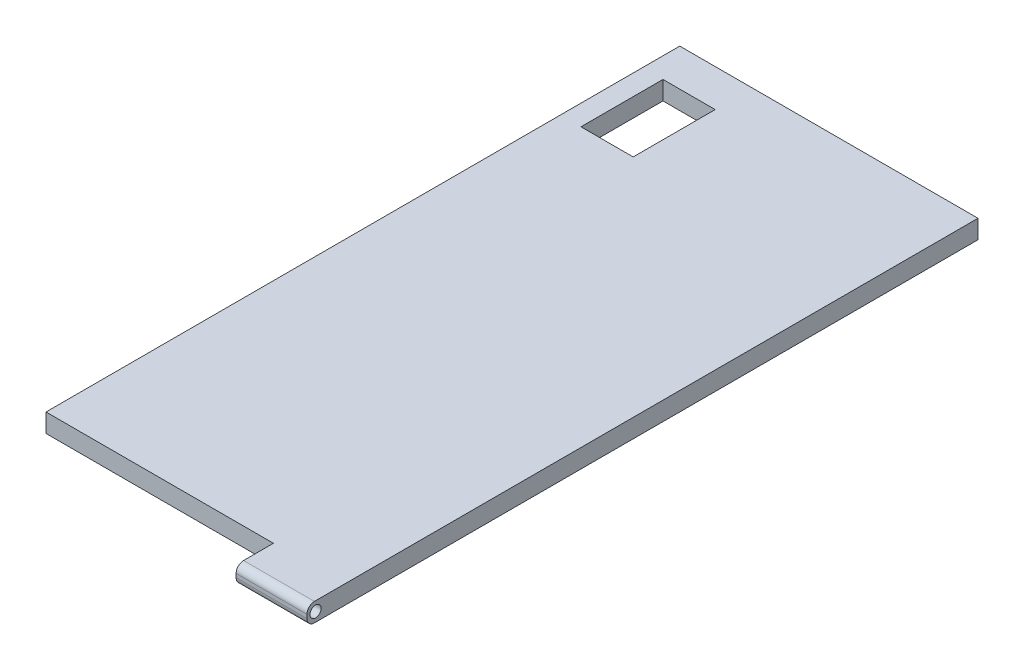
ISO-10303-21;
HEADER;
FILE_DESCRIPTION(('STEP AP214'),'2;1');
FILE_NAME('part.step','',(''),(''),'','','');
FILE_SCHEMA(('AUTOMOTIVE_DESIGN { 1 0 10303 214 1 1 1 1 }'));
ENDSEC;
DATA;
#1=APPLICATION_CONTEXT('core data for automotive mechanical design processes');
#2=APPLICATION_PROTOCOL_DEFINITION('international standard','automotive_design',2000,#1);
#3=PRODUCT_CONTEXT('',#1,'mechanical');
#4=PRODUCT('Part','Part','',(#3));
#5=PRODUCT_RELATED_PRODUCT_CATEGORY('part','',(#4));
#6=PRODUCT_DEFINITION_FORMATION('','',#4);
#7=PRODUCT_DEFINITION_CONTEXT('part definition',#1,'design');
#8=PRODUCT_DEFINITION('design','',#6,#7);
#9=PRODUCT_DEFINITION_SHAPE('','',#8);
#10=(LENGTH_UNIT() NAMED_UNIT(*) SI_UNIT(.MILLI.,.METRE.));
#11=(NAMED_UNIT(*) PLANE_ANGLE_UNIT() SI_UNIT($,.RADIAN.));
#12=(NAMED_UNIT(*) SI_UNIT($,.STERADIAN.) SOLID_ANGLE_UNIT());
#13=UNCERTAINTY_MEASURE_WITH_UNIT(LENGTH_MEASURE(1.E-05),#10,'distance_accuracy_value','');
#14=(GEOMETRIC_REPRESENTATION_CONTEXT(3) GLOBAL_UNCERTAINTY_ASSIGNED_CONTEXT((#13)) GLOBAL_UNIT_ASSIGNED_CONTEXT((#10,
#11,#12)) REPRESENTATION_CONTEXT('',''));
#15=CARTESIAN_POINT('',(0.,0.,0.));
#16=DIRECTION('',(0.,0.,1.));
#17=DIRECTION('',(1.,0.,0.));
#18=AXIS2_PLACEMENT_3D('',#15,#16,#17);
#19=CARTESIAN_POINT('',(20.,2.5,42.5));
#20=DIRECTION('',(-1.,0.,0.));
#21=DIRECTION('',(0.,0.,1.));
#22=AXIS2_PLACEMENT_3D('',#19,#20,#21);
#23=PLANE('',#22);
#24=CARTESIAN_POINT('',(20.,1.25,46.35));
#25=DIRECTION('',(-1.,0.,0.));
#26=DIRECTION('',(0.,0.,1.));
#27=AXIS2_PLACEMENT_3D('',#24,#25,#26);
#28=CIRCLE('',#27,0.749999999999999);
#29=CARTESIAN_POINT('',(20.,1.25,47.1));
#30=VERTEX_POINT('',#29);
#31=EDGE_CURVE('E341',#30,#30,#28,.T.);
#32=ORIENTED_EDGE('',*,*,#31,.T.);
#33=EDGE_LOOP('',(#32));
#34=FACE_BOUND('',#33,.T.);
#35=DIRECTION('',(0.,1.,0.));
#36=VECTOR('',#35,1.);
#37=CARTESIAN_POINT('',(20.,0.,47.5));
#38=LINE('',#37,#36);
#39=CARTESIAN_POINT('',(20.,1.,47.5));
#40=VERTEX_POINT('',#39);
#41=CARTESIAN_POINT('',(20.,1.5,47.5));
#42=VERTEX_POINT('',#41);
#43=EDGE_CURVE('E184',#40,#42,#38,.T.);
#44=ORIENTED_EDGE('',*,*,#43,.F.);
#45=CARTESIAN_POINT('',(20.,1.,46.5));
#46=DIRECTION('',(-1.,0.,0.));
#47=DIRECTION('',(0.,0.,1.));
#48=AXIS2_PLACEMENT_3D('',#45,#46,#47);
#49=CIRCLE('',#48,1.);
#50=CARTESIAN_POINT('',(20.,0.,46.5));
#51=VERTEX_POINT('',#50);
#52=EDGE_CURVE('E68',#40,#51,#49,.F.);
#53=ORIENTED_EDGE('',*,*,#52,.T.);
#54=DIRECTION('',(0.,0.,-1.));
#55=VECTOR('',#54,1.);
#56=CARTESIAN_POINT('',(20.,0.,42.5));
#57=LINE('',#56,#55);
#58=CARTESIAN_POINT('',(20.,0.,-42.5));
#59=VERTEX_POINT('',#58);
#60=EDGE_CURVE('E187',#51,#59,#57,.T.);
#61=ORIENTED_EDGE('',*,*,#60,.T.);
#62=DIRECTION('',(0.,-1.,0.));
#63=VECTOR('',#62,1.);
#64=CARTESIAN_POINT('',(20.,2.5,-42.5));
#65=LINE('',#64,#63);
#66=CARTESIAN_POINT('',(20.,2.5,-42.5));
#67=VERTEX_POINT('',#66);
#68=EDGE_CURVE('E227',#67,#59,#65,.T.);
#69=ORIENTED_EDGE('',*,*,#68,.F.);
#70=DIRECTION('',(0.,0.,-1.));
#71=VECTOR('',#70,1.);
#72=CARTESIAN_POINT('',(20.,2.5,42.5));
#73=LINE('',#72,#71);
#74=CARTESIAN_POINT('',(20.,2.5,46.5));
#75=VERTEX_POINT('',#74);
#76=EDGE_CURVE('E194',#75,#67,#73,.T.);
#77=ORIENTED_EDGE('',*,*,#76,.F.);
#78=CARTESIAN_POINT('',(20.,1.5,46.5));
#79=DIRECTION('',(-1.,0.,0.));
#80=DIRECTION('',(0.,0.,1.));
#81=AXIS2_PLACEMENT_3D('',#78,#79,#80);
#82=CIRCLE('',#81,1.);
#83=EDGE_CURVE('E246',#75,#42,#82,.F.);
#84=ORIENTED_EDGE('',*,*,#83,.T.);
#85=EDGE_LOOP('',(#44,#53,#61,#69,#77,#84));
#86=FACE_BOUND('',#85,.T.);
#87=ADVANCED_FACE('F45',(#34,#86),#23,.F.);
#88=CARTESIAN_POINT('',(-20.,2.5,-42.5));
#89=DIRECTION('',(0.,0.,1.));
#90=DIRECTION('',(1.,0.,0.));
#91=AXIS2_PLACEMENT_3D('',#88,#89,#90);
#92=PLANE('',#91);
#93=DIRECTION('',(-1.,0.,0.));
#94=VECTOR('',#93,1.);
#95=CARTESIAN_POINT('',(-20.,0.,-42.5));
#96=LINE('',#95,#94);
#97=CARTESIAN_POINT('',(-20.,0.,-42.5));
#98=VERTEX_POINT('',#97);
#99=EDGE_CURVE('E211',#59,#98,#96,.T.);
#100=ORIENTED_EDGE('',*,*,#99,.T.);
#101=DIRECTION('',(0.,-1.,0.));
#102=VECTOR('',#101,1.);
#103=CARTESIAN_POINT('',(-20.,2.5,-42.5));
#104=LINE('',#103,#102);
#105=CARTESIAN_POINT('',(-20.,2.5,-42.5));
#106=VERTEX_POINT('',#105);
#107=EDGE_CURVE('E223',#106,#98,#104,.T.);
#108=ORIENTED_EDGE('',*,*,#107,.F.);
#109=DIRECTION('',(-1.,0.,0.));
#110=VECTOR('',#109,1.);
#111=CARTESIAN_POINT('',(-20.,2.5,-42.5));
#112=LINE('',#111,#110);
#113=EDGE_CURVE('E197',#67,#106,#112,.T.);
#114=ORIENTED_EDGE('',*,*,#113,.F.);
#115=ORIENTED_EDGE('',*,*,#68,.T.);
#116=EDGE_LOOP('',(#100,#108,#114,#115));
#117=FACE_BOUND('',#116,.T.);
#118=ADVANCED_FACE('F292',(#117),#92,.F.);
#119=CARTESIAN_POINT('',(-20.,2.5,42.5));
#120=DIRECTION('',(1.,0.,0.));
#121=DIRECTION('',(0.,0.,-1.));
#122=AXIS2_PLACEMENT_3D('',#119,#120,#121);
#123=PLANE('',#122);
#124=DIRECTION('',(0.,0.,1.));
#125=VECTOR('',#124,1.);
#126=CARTESIAN_POINT('',(-20.,0.,42.5));
#127=LINE('',#126,#125);
#128=CARTESIAN_POINT('',(-20.,0.,42.5));
#129=VERTEX_POINT('',#128);
#130=EDGE_CURVE('E214',#98,#129,#127,.T.);
#131=ORIENTED_EDGE('',*,*,#130,.T.);
#132=DIRECTION('',(0.,-1.,0.));
#133=VECTOR('',#132,1.);
#134=CARTESIAN_POINT('',(-20.,2.5,42.5));
#135=LINE('',#134,#133);
#136=CARTESIAN_POINT('',(-20.,2.5,42.5));
#137=VERTEX_POINT('',#136);
#138=EDGE_CURVE('E208',#137,#129,#135,.T.);
#139=ORIENTED_EDGE('',*,*,#138,.F.);
#140=DIRECTION('',(0.,0.,1.));
#141=VECTOR('',#140,1.);
#142=CARTESIAN_POINT('',(-20.,2.5,42.5));
#143=LINE('',#142,#141);
#144=EDGE_CURVE('E201',#106,#137,#143,.T.);
#145=ORIENTED_EDGE('',*,*,#144,.F.);
#146=ORIENTED_EDGE('',*,*,#107,.T.);
#147=EDGE_LOOP('',(#131,#139,#145,#146));
#148=FACE_BOUND('',#147,.T.);
#149=ADVANCED_FACE('F288',(#148),#123,.F.);
#150=CARTESIAN_POINT('',(-20.,2.5,42.5));
#151=DIRECTION('',(0.,0.,-1.));
#152=DIRECTION('',(-1.,0.,0.));
#153=AXIS2_PLACEMENT_3D('',#150,#151,#152);
#154=PLANE('',#153);
#155=DIRECTION('',(1.,0.,0.));
#156=VECTOR('',#155,1.);
#157=CARTESIAN_POINT('',(-20.,0.,42.5));
#158=LINE('',#157,#156);
#159=CARTESIAN_POINT('',(10.5,0.,42.5));
#160=VERTEX_POINT('',#159);
#161=EDGE_CURVE('E198',#129,#160,#158,.T.);
#162=ORIENTED_EDGE('',*,*,#161,.T.);
#163=DIRECTION('',(0.,1.,0.));
#164=VECTOR('',#163,1.);
#165=CARTESIAN_POINT('',(10.5,0.,42.5));
#166=LINE('',#165,#164);
#167=CARTESIAN_POINT('',(10.5,2.5,42.5));
#168=VERTEX_POINT('',#167);
#169=EDGE_CURVE('E180',#160,#168,#166,.T.);
#170=ORIENTED_EDGE('',*,*,#169,.T.);
#171=DIRECTION('',(1.,0.,0.));
#172=VECTOR('',#171,1.);
#173=CARTESIAN_POINT('',(-20.,2.5,42.5));
#174=LINE('',#173,#172);
#175=EDGE_CURVE('E204',#137,#168,#174,.T.);
#176=ORIENTED_EDGE('',*,*,#175,.F.);
#177=ORIENTED_EDGE('',*,*,#138,.T.);
#178=EDGE_LOOP('',(#162,#170,#176,#177));
#179=FACE_BOUND('',#178,.T.);
#180=ADVANCED_FACE('F282',(#179),#154,.F.);
#181=CARTESIAN_POINT('',(0.,2.5,0.));
#182=DIRECTION('',(0.,-1.,0.));
#183=DIRECTION('',(0.,0.,-1.));
#184=AXIS2_PLACEMENT_3D('',#181,#182,#183);
#185=PLANE('',#184);
#186=DIRECTION('',(1.,0.,0.));
#187=VECTOR('',#186,1.);
#188=CARTESIAN_POINT('',(-17.25,2.5,-26.5));
#189=LINE('',#188,#187);
#190=CARTESIAN_POINT('',(-17.25,2.5,-26.5));
#191=VERTEX_POINT('',#190);
#192=CARTESIAN_POINT('',(-10.25,2.5,-26.5));
#193=VERTEX_POINT('',#192);
#194=EDGE_CURVE('E151',#191,#193,#189,.T.);
#195=ORIENTED_EDGE('',*,*,#194,.F.);
#196=DIRECTION('',(0.,0.,1.));
#197=VECTOR('',#196,1.);
#198=CARTESIAN_POINT('',(-17.25,2.5,-37.5));
#199=LINE('',#198,#197);
#200=CARTESIAN_POINT('',(-17.25,2.5,-37.5));
#201=VERTEX_POINT('',#200);
#202=EDGE_CURVE('E157',#201,#191,#199,.T.);
#203=ORIENTED_EDGE('',*,*,#202,.F.);
#204=DIRECTION('',(-1.,0.,0.));
#205=VECTOR('',#204,1.);
#206=CARTESIAN_POINT('',(-17.25,2.5,-37.5));
#207=LINE('',#206,#205);
#208=CARTESIAN_POINT('',(-10.25,2.5,-37.5));
#209=VERTEX_POINT('',#208);
#210=EDGE_CURVE('E162',#209,#201,#207,.T.);
#211=ORIENTED_EDGE('',*,*,#210,.F.);
#212=DIRECTION('',(0.,0.,-1.));
#213=VECTOR('',#212,1.);
#214=CARTESIAN_POINT('',(-10.25,2.5,-37.5));
#215=LINE('',#214,#213);
#216=EDGE_CURVE('E139',#193,#209,#215,.T.);
#217=ORIENTED_EDGE('',*,*,#216,.F.);
#218=EDGE_LOOP('',(#195,#203,#211,#217));
#219=FACE_BOUND('',#218,.T.);
#220=DIRECTION('',(0.,0.,1.));
#221=VECTOR('',#220,1.);
#222=CARTESIAN_POINT('',(10.5,2.5,42.5));
#223=LINE('',#222,#221);
#224=CARTESIAN_POINT('',(10.5,2.5,46.5));
#225=VERTEX_POINT('',#224);
#226=EDGE_CURVE('E172',#168,#225,#223,.T.);
#227=ORIENTED_EDGE('',*,*,#226,.T.);
#228=DIRECTION('',(1.,0.,0.));
#229=VECTOR('',#228,1.);
#230=CARTESIAN_POINT('',(20.,2.5,46.5));
#231=LINE('',#230,#229);
#232=EDGE_CURVE('E242',#225,#75,#231,.T.);
#233=ORIENTED_EDGE('',*,*,#232,.T.);
#234=ORIENTED_EDGE('',*,*,#76,.T.);
#235=ORIENTED_EDGE('',*,*,#113,.T.);
#236=ORIENTED_EDGE('',*,*,#144,.T.);
#237=ORIENTED_EDGE('',*,*,#175,.T.);
#238=EDGE_LOOP('',(#227,#233,#234,#235,#236,#237));
#239=FACE_BOUND('',#238,.T.);
#240=ADVANCED_FACE('F159',(#219,#239),#185,.F.);
#241=CARTESIAN_POINT('',(0.,0.,0.));
#242=DIRECTION('',(0.,-1.,0.));
#243=DIRECTION('',(0.,0.,-1.));
#244=AXIS2_PLACEMENT_3D('',#241,#242,#243);
#245=PLANE('',#244);
#246=DIRECTION('',(0.,0.,-1.));
#247=VECTOR('',#246,1.);
#248=CARTESIAN_POINT('',(-17.25,0.,0.));
#249=LINE('',#248,#247);
#250=CARTESIAN_POINT('',(-17.25,0.,-26.5));
#251=VERTEX_POINT('',#250);
#252=CARTESIAN_POINT('',(-17.25,0.,-37.5));
#253=VERTEX_POINT('',#252);
#254=EDGE_CURVE('E239',#251,#253,#249,.T.);
#255=ORIENTED_EDGE('',*,*,#254,.F.);
#256=DIRECTION('',(-1.,0.,0.));
#257=VECTOR('',#256,1.);
#258=CARTESIAN_POINT('',(0.,0.,-26.5));
#259=LINE('',#258,#257);
#260=CARTESIAN_POINT('',(-10.25,0.,-26.5));
#261=VERTEX_POINT('',#260);
#262=EDGE_CURVE('E231',#261,#251,#259,.T.);
#263=ORIENTED_EDGE('',*,*,#262,.F.);
#264=DIRECTION('',(0.,0.,1.));
#265=VECTOR('',#264,1.);
#266=CARTESIAN_POINT('',(-10.25,0.,0.));
#267=LINE('',#266,#265);
#268=CARTESIAN_POINT('',(-10.25,0.,-37.5));
#269=VERTEX_POINT('',#268);
#270=EDGE_CURVE('E142',#269,#261,#267,.T.);
#271=ORIENTED_EDGE('',*,*,#270,.F.);
#272=DIRECTION('',(1.,0.,0.));
#273=VECTOR('',#272,1.);
#274=CARTESIAN_POINT('',(0.,0.,-37.5));
#275=LINE('',#274,#273);
#276=EDGE_CURVE('E236',#253,#269,#275,.T.);
#277=ORIENTED_EDGE('',*,*,#276,.F.);
#278=EDGE_LOOP('',(#255,#263,#271,#277));
#279=FACE_BOUND('',#278,.T.);
#280=ORIENTED_EDGE('',*,*,#60,.F.);
#281=DIRECTION('',(1.,0.,0.));
#282=VECTOR('',#281,1.);
#283=CARTESIAN_POINT('',(0.,0.,46.5));
#284=LINE('',#283,#282);
#285=CARTESIAN_POINT('',(10.5,0.,46.5));
#286=VERTEX_POINT('',#285);
#287=EDGE_CURVE('E54',#51,#286,#284,.F.);
#288=ORIENTED_EDGE('',*,*,#287,.T.);
#289=DIRECTION('',(0.,0.,1.));
#290=VECTOR('',#289,1.);
#291=CARTESIAN_POINT('',(10.5,0.,42.5));
#292=LINE('',#291,#290);
#293=EDGE_CURVE('E177',#160,#286,#292,.T.);
#294=ORIENTED_EDGE('',*,*,#293,.F.);
#295=ORIENTED_EDGE('',*,*,#161,.F.);
#296=ORIENTED_EDGE('',*,*,#130,.F.);
#297=ORIENTED_EDGE('',*,*,#99,.F.);
#298=EDGE_LOOP('',(#280,#288,#294,#295,#296,#297));
#299=FACE_BOUND('',#298,.T.);
#300=ADVANCED_FACE('F284',(#279,#299),#245,.T.);
#301=CARTESIAN_POINT('',(20.,0.,47.5));
#302=DIRECTION('',(0.,0.,1.));
#303=DIRECTION('',(1.,0.,0.));
#304=AXIS2_PLACEMENT_3D('',#301,#302,#303);
#305=PLANE('',#304);
#306=DIRECTION('',(0.,1.,0.));
#307=VECTOR('',#306,1.);
#308=CARTESIAN_POINT('',(10.5,0.,47.5));
#309=LINE('',#308,#307);
#310=CARTESIAN_POINT('',(10.5,1.,47.5));
#311=VERTEX_POINT('',#310);
#312=CARTESIAN_POINT('',(10.5,1.5,47.5));
#313=VERTEX_POINT('',#312);
#314=EDGE_CURVE('E188',#311,#313,#309,.T.);
#315=ORIENTED_EDGE('',*,*,#314,.F.);
#316=DIRECTION('',(1.,0.,0.));
#317=VECTOR('',#316,1.);
#318=CARTESIAN_POINT('',(20.,1.,47.5));
#319=LINE('',#318,#317);
#320=EDGE_CURVE('E257',#311,#40,#319,.T.);
#321=ORIENTED_EDGE('',*,*,#320,.T.);
#322=ORIENTED_EDGE('',*,*,#43,.T.);
#323=DIRECTION('',(1.,0.,0.));
#324=VECTOR('',#323,1.);
#325=CARTESIAN_POINT('',(10.5,1.5,47.5));
#326=LINE('',#325,#324);
#327=EDGE_CURVE('E250',#42,#313,#326,.F.);
#328=ORIENTED_EDGE('',*,*,#327,.T.);
#329=EDGE_LOOP('',(#315,#321,#322,#328));
#330=FACE_BOUND('',#329,.T.);
#331=ADVANCED_FACE('F266',(#330),#305,.T.);
#332=CARTESIAN_POINT('',(10.5,0.,42.5));
#333=DIRECTION('',(-1.,0.,0.));
#334=DIRECTION('',(0.,0.,1.));
#335=AXIS2_PLACEMENT_3D('',#332,#333,#334);
#336=PLANE('',#335);
#337=CARTESIAN_POINT('',(10.5,1.25,46.35));
#338=DIRECTION('',(-1.,0.,0.));
#339=DIRECTION('',(0.,0.,1.));
#340=AXIS2_PLACEMENT_3D('',#337,#338,#339);
#341=CIRCLE('',#340,0.749999999999999);
#342=CARTESIAN_POINT('',(10.5,1.25,47.1));
#343=VERTEX_POINT('',#342);
#344=EDGE_CURVE('E343',#343,#343,#341,.T.);
#345=ORIENTED_EDGE('',*,*,#344,.F.);
#346=EDGE_LOOP('',(#345));
#347=FACE_BOUND('',#346,.T.);
#348=ORIENTED_EDGE('',*,*,#293,.T.);
#349=CARTESIAN_POINT('',(10.5,1.,46.5));
#350=DIRECTION('',(-1.,0.,0.));
#351=DIRECTION('',(0.,0.,1.));
#352=AXIS2_PLACEMENT_3D('',#349,#350,#351);
#353=CIRCLE('',#352,1.);
#354=EDGE_CURVE('E11',#286,#311,#353,.T.);
#355=ORIENTED_EDGE('',*,*,#354,.T.);
#356=ORIENTED_EDGE('',*,*,#314,.T.);
#357=CARTESIAN_POINT('',(10.5,1.5,46.5));
#358=DIRECTION('',(-1.,0.,0.));
#359=DIRECTION('',(0.,0.,1.));
#360=AXIS2_PLACEMENT_3D('',#357,#358,#359);
#361=CIRCLE('',#360,1.);
#362=EDGE_CURVE('E254',#313,#225,#361,.T.);
#363=ORIENTED_EDGE('',*,*,#362,.T.);
#364=ORIENTED_EDGE('',*,*,#226,.F.);
#365=ORIENTED_EDGE('',*,*,#169,.F.);
#366=EDGE_LOOP('',(#348,#355,#356,#363,#364,#365));
#367=FACE_BOUND('',#366,.T.);
#368=ADVANCED_FACE('F277',(#347,#367),#336,.T.);
#369=CARTESIAN_POINT('',(-17.25,-2.5,-37.5));
#370=DIRECTION('',(-1.,0.,0.));
#371=DIRECTION('',(0.,0.,1.));
#372=AXIS2_PLACEMENT_3D('',#369,#370,#371);
#373=PLANE('',#372);
#374=ORIENTED_EDGE('',*,*,#254,.T.);
#375=DIRECTION('',(0.,1.,0.));
#376=VECTOR('',#375,1.);
#377=CARTESIAN_POINT('',(-17.25,-2.5,-37.5));
#378=LINE('',#377,#376);
#379=EDGE_CURVE('E169',#253,#201,#378,.T.);
#380=ORIENTED_EDGE('',*,*,#379,.T.);
#381=ORIENTED_EDGE('',*,*,#202,.T.);
#382=DIRECTION('',(0.,1.,0.));
#383=VECTOR('',#382,1.);
#384=CARTESIAN_POINT('',(-17.25,-2.5,-26.5));
#385=LINE('',#384,#383);
#386=EDGE_CURVE('E147',#251,#191,#385,.T.);
#387=ORIENTED_EDGE('',*,*,#386,.F.);
#388=EDGE_LOOP('',(#374,#380,#381,#387));
#389=FACE_BOUND('',#388,.T.);
#390=ADVANCED_FACE('F322',(#389),#373,.F.);
#391=CARTESIAN_POINT('',(-17.25,-2.5,-37.5));
#392=DIRECTION('',(0.,0.,-1.));
#393=DIRECTION('',(-1.,0.,0.));
#394=AXIS2_PLACEMENT_3D('',#391,#392,#393);
#395=PLANE('',#394);
#396=ORIENTED_EDGE('',*,*,#276,.T.);
#397=DIRECTION('',(0.,1.,0.));
#398=VECTOR('',#397,1.);
#399=CARTESIAN_POINT('',(-10.25,-2.5,-37.5));
#400=LINE('',#399,#398);
#401=EDGE_CURVE('E146',#269,#209,#400,.T.);
#402=ORIENTED_EDGE('',*,*,#401,.T.);
#403=ORIENTED_EDGE('',*,*,#210,.T.);
#404=ORIENTED_EDGE('',*,*,#379,.F.);
#405=EDGE_LOOP('',(#396,#402,#403,#404));
#406=FACE_BOUND('',#405,.T.);
#407=ADVANCED_FACE('F327',(#406),#395,.F.);
#408=CARTESIAN_POINT('',(-10.25,-2.5,-37.5));
#409=DIRECTION('',(1.,0.,0.));
#410=DIRECTION('',(0.,0.,-1.));
#411=AXIS2_PLACEMENT_3D('',#408,#409,#410);
#412=PLANE('',#411);
#413=ORIENTED_EDGE('',*,*,#270,.T.);
#414=DIRECTION('',(0.,1.,0.));
#415=VECTOR('',#414,1.);
#416=CARTESIAN_POINT('',(-10.25,-2.5,-26.5));
#417=LINE('',#416,#415);
#418=EDGE_CURVE('E134',#261,#193,#417,.T.);
#419=ORIENTED_EDGE('',*,*,#418,.T.);
#420=ORIENTED_EDGE('',*,*,#216,.T.);
#421=ORIENTED_EDGE('',*,*,#401,.F.);
#422=EDGE_LOOP('',(#413,#419,#420,#421));
#423=FACE_BOUND('',#422,.T.);
#424=ADVANCED_FACE('F136',(#423),#412,.F.);
#425=CARTESIAN_POINT('',(-17.25,-2.5,-26.5));
#426=DIRECTION('',(0.,0.,1.));
#427=DIRECTION('',(1.,0.,0.));
#428=AXIS2_PLACEMENT_3D('',#425,#426,#427);
#429=PLANE('',#428);
#430=ORIENTED_EDGE('',*,*,#262,.T.);
#431=ORIENTED_EDGE('',*,*,#386,.T.);
#432=ORIENTED_EDGE('',*,*,#194,.T.);
#433=ORIENTED_EDGE('',*,*,#418,.F.);
#434=EDGE_LOOP('',(#430,#431,#432,#433));
#435=FACE_BOUND('',#434,.T.);
#436=ADVANCED_FACE('F152',(#435),#429,.F.);
#437=CARTESIAN_POINT('',(0.,1.5,46.5));
#438=DIRECTION('',(-1.,0.,0.));
#439=DIRECTION('',(0.,0.,1.));
#440=AXIS2_PLACEMENT_3D('',#437,#438,#439);
#441=CYLINDRICAL_SURFACE('',#440,1.);
#442=ORIENTED_EDGE('',*,*,#362,.F.);
#443=ORIENTED_EDGE('',*,*,#327,.F.);
#444=ORIENTED_EDGE('',*,*,#83,.F.);
#445=ORIENTED_EDGE('',*,*,#232,.F.);
#446=EDGE_LOOP('',(#442,#443,#444,#445));
#447=FACE_BOUND('',#446,.T.);
#448=ADVANCED_FACE('F275',(#447),#441,.T.);
#449=CARTESIAN_POINT('',(20.,1.,46.5));
#450=DIRECTION('',(1.,0.,0.));
#451=DIRECTION('',(0.,0.,-1.));
#452=AXIS2_PLACEMENT_3D('',#449,#450,#451);
#453=CYLINDRICAL_SURFACE('',#452,1.);
#454=ORIENTED_EDGE('',*,*,#354,.F.);
#455=ORIENTED_EDGE('',*,*,#287,.F.);
#456=ORIENTED_EDGE('',*,*,#52,.F.);
#457=ORIENTED_EDGE('',*,*,#320,.F.);
#458=EDGE_LOOP('',(#454,#455,#456,#457));
#459=FACE_BOUND('',#458,.T.);
#460=ADVANCED_FACE('F47',(#459),#453,.T.);
#461=CARTESIAN_POINT('',(20.5,1.25,46.35));
#462=DIRECTION('',(-1.,0.,0.));
#463=DIRECTION('',(0.,0.,1.));
#464=AXIS2_PLACEMENT_3D('',#461,#462,#463);
#465=CYLINDRICAL_SURFACE('',#464,0.749999999999999);
#466=ORIENTED_EDGE('',*,*,#344,.T.);
#467=EDGE_LOOP('',(#466));
#468=FACE_BOUND('',#467,.T.);
#469=ORIENTED_EDGE('',*,*,#31,.F.);
#470=EDGE_LOOP('',(#469));
#471=FACE_BOUND('',#470,.T.);
#472=ADVANCED_FACE('F294',(#468,#471),#465,.F.);
#473=CLOSED_SHELL('',(#87,#118,#149,#180,#240,#300,#331,#368,#390,#407,#424,#436,#448,#460,#472));
#474=MANIFOLD_SOLID_BREP('B2',#473);
#475=ADVANCED_BREP_SHAPE_REPRESENTATION('',(#18,#474),#14);
#476=SHAPE_DEFINITION_REPRESENTATION(#9,#475);
ENDSEC;
END-ISO-10303-21;
